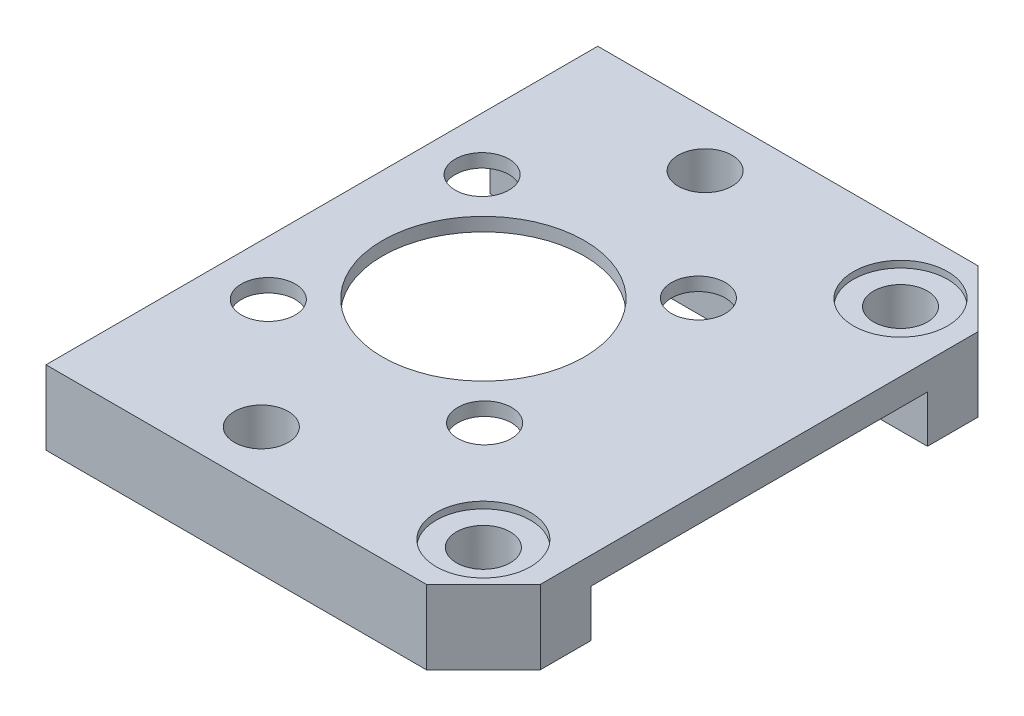
ISO-10303-21;
HEADER;
FILE_DESCRIPTION(('STEP AP214'),'2;1');
FILE_NAME('part.step','',(''),(''),'','','');
FILE_SCHEMA(('AUTOMOTIVE_DESIGN { 1 0 10303 214 1 1 1 1 }'));
ENDSEC;
DATA;
#1=APPLICATION_CONTEXT('core data for automotive mechanical design processes');
#2=APPLICATION_PROTOCOL_DEFINITION('international standard','automotive_design',2000,#1);
#3=PRODUCT_CONTEXT('',#1,'mechanical');
#4=PRODUCT('Part','Part','',(#3));
#5=PRODUCT_RELATED_PRODUCT_CATEGORY('part','',(#4));
#6=PRODUCT_DEFINITION_FORMATION('','',#4);
#7=PRODUCT_DEFINITION_CONTEXT('part definition',#1,'design');
#8=PRODUCT_DEFINITION('design','',#6,#7);
#9=PRODUCT_DEFINITION_SHAPE('','',#8);
#10=(LENGTH_UNIT() NAMED_UNIT(*) SI_UNIT(.MILLI.,.METRE.));
#11=(NAMED_UNIT(*) PLANE_ANGLE_UNIT() SI_UNIT($,.RADIAN.));
#12=(NAMED_UNIT(*) SI_UNIT($,.STERADIAN.) SOLID_ANGLE_UNIT());
#13=UNCERTAINTY_MEASURE_WITH_UNIT(LENGTH_MEASURE(1.E-05),#10,'distance_accuracy_value','');
#14=(GEOMETRIC_REPRESENTATION_CONTEXT(3) GLOBAL_UNCERTAINTY_ASSIGNED_CONTEXT((#13)) GLOBAL_UNIT_ASSIGNED_CONTEXT((#10,
#11,#12)) REPRESENTATION_CONTEXT('',''));
#15=CARTESIAN_POINT('',(0.,0.,0.));
#16=DIRECTION('',(0.,0.,1.));
#17=DIRECTION('',(1.,0.,0.));
#18=AXIS2_PLACEMENT_3D('',#15,#16,#17);
#19=CARTESIAN_POINT('',(12.5,1.,-12.5));
#20=DIRECTION('',(1.,0.,0.));
#21=DIRECTION('',(0.,0.,-1.));
#22=AXIS2_PLACEMENT_3D('',#19,#20,#21);
#23=PLANE('',#22);
#24=DIRECTION('',(0.,0.,1.));
#25=VECTOR('',#24,1.);
#26=CARTESIAN_POINT('',(12.5,0.,-12.5));
#27=LINE('',#26,#25);
#28=CARTESIAN_POINT('',(12.5,0.,-12.5));
#29=VERTEX_POINT('',#28);
#30=CARTESIAN_POINT('',(12.5,0.,12.5));
#31=VERTEX_POINT('',#30);
#32=EDGE_CURVE('E177',#29,#31,#27,.T.);
#33=ORIENTED_EDGE('',*,*,#32,.T.);
#34=DIRECTION('',(0.,-1.,0.));
#35=VECTOR('',#34,1.);
#36=CARTESIAN_POINT('',(12.5,1.,12.5));
#37=LINE('',#36,#35);
#38=CARTESIAN_POINT('',(12.5,1.,12.5));
#39=VERTEX_POINT('',#38);
#40=EDGE_CURVE('E189',#39,#31,#37,.T.);
#41=ORIENTED_EDGE('',*,*,#40,.F.);
#42=DIRECTION('',(0.,0.,1.));
#43=VECTOR('',#42,1.);
#44=CARTESIAN_POINT('',(12.5,1.,-12.5));
#45=LINE('',#44,#43);
#46=CARTESIAN_POINT('',(12.5,1.,-12.5));
#47=VERTEX_POINT('',#46);
#48=EDGE_CURVE('E183',#47,#39,#45,.T.);
#49=ORIENTED_EDGE('',*,*,#48,.F.);
#50=DIRECTION('',(0.,-1.,0.));
#51=VECTOR('',#50,1.);
#52=CARTESIAN_POINT('',(12.5,1.,-12.5));
#53=LINE('',#52,#51);
#54=EDGE_CURVE('E191',#47,#29,#53,.T.);
#55=ORIENTED_EDGE('',*,*,#54,.T.);
#56=EDGE_LOOP('',(#33,#41,#49,#55));
#57=FACE_BOUND('',#56,.T.);
#58=ADVANCED_FACE('F41',(#57),#23,.F.);
#59=CARTESIAN_POINT('',(0.,2.,0.));
#60=DIRECTION('',(0.,-1.,0.));
#61=DIRECTION('',(0.,0.,-1.));
#62=AXIS2_PLACEMENT_3D('',#59,#60,#61);
#63=PLANE('',#62);
#64=DIRECTION('',(-1.,0.,0.));
#65=VECTOR('',#64,1.);
#66=CARTESIAN_POINT('',(-20.5,2.,-20.5));
#67=LINE('',#66,#65);
#68=CARTESIAN_POINT('',(16.2573593128807,2.,-20.5));
#69=VERTEX_POINT('',#68);
#70=CARTESIAN_POINT('',(-12.,2.,-20.5));
#71=VERTEX_POINT('',#70);
#72=EDGE_CURVE('E228',#69,#71,#67,.T.);
#73=ORIENTED_EDGE('',*,*,#72,.T.);
#74=DIRECTION('',(0.,0.,-1.));
#75=VECTOR('',#74,1.);
#76=CARTESIAN_POINT('',(-12.,2.,-20.5));
#77=LINE('',#76,#75);
#78=CARTESIAN_POINT('',(-12.0000000000002,2.,20.5));
#79=VERTEX_POINT('',#78);
#80=EDGE_CURVE('E414',#79,#71,#77,.T.);
#81=ORIENTED_EDGE('',*,*,#80,.F.);
#82=DIRECTION('',(1.,0.,0.));
#83=VECTOR('',#82,1.);
#84=CARTESIAN_POINT('',(-20.5,2.,20.5));
#85=LINE('',#84,#83);
#86=CARTESIAN_POINT('',(16.2573593128807,2.,20.5));
#87=VERTEX_POINT('',#86);
#88=EDGE_CURVE('E146',#79,#87,#85,.T.);
#89=ORIENTED_EDGE('',*,*,#88,.T.);
#90=DIRECTION('',(-0.707106781186546,0.,0.707106781186549));
#91=VECTOR('',#90,1.);
#92=CARTESIAN_POINT('',(20.5,2.,16.2573593128807));
#93=LINE('',#92,#91);
#94=CARTESIAN_POINT('',(20.5,2.,16.2573593128807));
#95=VERTEX_POINT('',#94);
#96=EDGE_CURVE('E175',#95,#87,#93,.T.);
#97=ORIENTED_EDGE('',*,*,#96,.F.);
#98=DIRECTION('',(0.,0.,-1.));
#99=VECTOR('',#98,1.);
#100=CARTESIAN_POINT('',(20.5,2.,20.5));
#101=LINE('',#100,#99);
#102=CARTESIAN_POINT('',(20.5,2.,-16.2573593128807));
#103=VERTEX_POINT('',#102);
#104=EDGE_CURVE('E225',#95,#103,#101,.T.);
#105=ORIENTED_EDGE('',*,*,#104,.T.);
#106=DIRECTION('',(0.707106781186549,0.,0.707106781186546));
#107=VECTOR('',#106,1.);
#108=CARTESIAN_POINT('',(16.2573593128807,2.,-20.5));
#109=LINE('',#108,#107);
#110=EDGE_CURVE('E171',#69,#103,#109,.T.);
#111=ORIENTED_EDGE('',*,*,#110,.F.);
#112=EDGE_LOOP('',(#73,#81,#89,#97,#105,#111));
#113=FACE_BOUND('',#112,.T.);
#114=CARTESIAN_POINT('',(15.5000000000001,2.,-15.4999999999999));
#115=DIRECTION('',(0.,1.,0.));
#116=DIRECTION('',(0.,0.,1.));
#117=AXIS2_PLACEMENT_3D('',#114,#115,#116);
#118=CIRCLE('',#117,3.5);
#119=CARTESIAN_POINT('',(15.5000000000001,2.,-11.9999999999999));
#120=VERTEX_POINT('',#119);
#121=EDGE_CURVE('E352',#120,#120,#118,.T.);
#122=ORIENTED_EDGE('',*,*,#121,.F.);
#123=EDGE_LOOP('',(#122));
#124=FACE_BOUND('',#123,.T.);
#125=CARTESIAN_POINT('',(15.4999999999999,2.,15.5000000000001));
#126=DIRECTION('',(0.,1.,0.));
#127=DIRECTION('',(0.,0.,1.));
#128=AXIS2_PLACEMENT_3D('',#125,#126,#127);
#129=CIRCLE('',#128,3.5);
#130=CARTESIAN_POINT('',(15.4999999999999,2.,19.0000000000001));
#131=VERTEX_POINT('',#130);
#132=EDGE_CURVE('E348',#131,#131,#129,.T.);
#133=ORIENTED_EDGE('',*,*,#132,.F.);
#134=EDGE_LOOP('',(#133));
#135=FACE_BOUND('',#134,.T.);
#136=CARTESIAN_POINT('',(0.,2.,16.5));
#137=DIRECTION('',(0.,-1.,0.));
#138=DIRECTION('',(0.,0.,-1.));
#139=AXIS2_PLACEMENT_3D('',#136,#137,#138);
#140=CIRCLE('',#139,2.);
#141=CARTESIAN_POINT('',(0.,2.,14.5));
#142=VERTEX_POINT('',#141);
#143=EDGE_CURVE('E155',#142,#142,#140,.T.);
#144=ORIENTED_EDGE('',*,*,#143,.T.);
#145=EDGE_LOOP('',(#144));
#146=FACE_BOUND('',#145,.T.);
#147=CARTESIAN_POINT('',(-7.94318190681312,2.,8.03715504362562));
#148=DIRECTION('',(0.,-1.,0.));
#149=DIRECTION('',(0.,0.,-1.));
#150=AXIS2_PLACEMENT_3D('',#147,#148,#149);
#151=CIRCLE('',#150,2.);
#152=CARTESIAN_POINT('',(-7.94318190681312,2.,6.03715504362562));
#153=VERTEX_POINT('',#152);
#154=EDGE_CURVE('E216',#153,#153,#151,.T.);
#155=ORIENTED_EDGE('',*,*,#154,.T.);
#156=EDGE_LOOP('',(#155));
#157=FACE_BOUND('',#156,.T.);
#158=CARTESIAN_POINT('',(8.03715504362564,2.,7.94318190681309));
#159=DIRECTION('',(0.,-1.,0.));
#160=DIRECTION('',(0.,0.,-1.));
#161=AXIS2_PLACEMENT_3D('',#158,#159,#160);
#162=CIRCLE('',#161,2.);
#163=CARTESIAN_POINT('',(8.03715504362564,2.,5.94318190681309));
#164=VERTEX_POINT('',#163);
#165=EDGE_CURVE('E213',#164,#164,#162,.T.);
#166=ORIENTED_EDGE('',*,*,#165,.T.);
#167=EDGE_LOOP('',(#166));
#168=FACE_BOUND('',#167,.T.);
#169=CARTESIAN_POINT('',(7.94318190681312,2.,-8.03715504362567));
#170=DIRECTION('',(0.,-1.,0.));
#171=DIRECTION('',(0.,0.,-1.));
#172=AXIS2_PLACEMENT_3D('',#169,#170,#171);
#173=CIRCLE('',#172,2.);
#174=CARTESIAN_POINT('',(7.94318190681312,2.,-10.0371550436257));
#175=VERTEX_POINT('',#174);
#176=EDGE_CURVE('E217',#175,#175,#173,.T.);
#177=ORIENTED_EDGE('',*,*,#176,.T.);
#178=EDGE_LOOP('',(#177));
#179=FACE_BOUND('',#178,.T.);
#180=CARTESIAN_POINT('',(-8.03715504362565,2.,-7.94318190681315));
#181=DIRECTION('',(0.,-1.,0.));
#182=DIRECTION('',(0.,0.,-1.));
#183=AXIS2_PLACEMENT_3D('',#180,#181,#182);
#184=CIRCLE('',#183,2.);
#185=CARTESIAN_POINT('',(-8.03715504362565,2.,-9.94318190681315));
#186=VERTEX_POINT('',#185);
#187=EDGE_CURVE('E212',#186,#186,#184,.T.);
#188=ORIENTED_EDGE('',*,*,#187,.T.);
#189=EDGE_LOOP('',(#188));
#190=FACE_BOUND('',#189,.T.);
#191=CARTESIAN_POINT('',(0.,2.,0.));
#192=DIRECTION('',(0.,1.,0.));
#193=DIRECTION('',(0.,0.,1.));
#194=AXIS2_PLACEMENT_3D('',#191,#192,#193);
#195=CIRCLE('',#194,7.5);
#196=CARTESIAN_POINT('',(0.,2.,7.5));
#197=VERTEX_POINT('',#196);
#198=EDGE_CURVE('E209',#197,#197,#195,.T.);
#199=ORIENTED_EDGE('',*,*,#198,.F.);
#200=EDGE_LOOP('',(#199));
#201=FACE_BOUND('',#200,.T.);
#202=CARTESIAN_POINT('',(0.,2.,-16.4789088056835));
#203=DIRECTION('',(0.,-1.,0.));
#204=DIRECTION('',(0.,0.,-1.));
#205=AXIS2_PLACEMENT_3D('',#202,#203,#204);
#206=CIRCLE('',#205,2.);
#207=CARTESIAN_POINT('',(0.,2.,-18.4789088056835));
#208=VERTEX_POINT('',#207);
#209=EDGE_CURVE('E400',#208,#208,#206,.F.);
#210=ORIENTED_EDGE('',*,*,#209,.F.);
#211=EDGE_LOOP('',(#210));
#212=FACE_BOUND('',#211,.T.);
#213=ADVANCED_FACE('F252',(#113,#124,#135,#146,#157,#168,#179,#190,#201,#212),#63,.F.);
#214=CARTESIAN_POINT('',(15.4999999999999,-13.3994949366117,15.5000000000001));
#215=DIRECTION('',(0.,1.,0.));
#216=DIRECTION('',(0.,0.,1.));
#217=AXIS2_PLACEMENT_3D('',#214,#215,#216);
#218=CYLINDRICAL_SURFACE('',#217,3.5);
#219=ORIENTED_EDGE('',*,*,#132,.T.);
#220=EDGE_LOOP('',(#219));
#221=FACE_BOUND('',#220,.T.);
#222=CARTESIAN_POINT('',(15.4999999999999,1.5,15.5000000000001));
#223=DIRECTION('',(0.,-1.,0.));
#224=DIRECTION('',(0.,0.,-1.));
#225=AXIS2_PLACEMENT_3D('',#222,#223,#224);
#226=CIRCLE('',#225,3.5);
#227=CARTESIAN_POINT('',(15.4999999999999,1.5,12.0000000000001));
#228=VERTEX_POINT('',#227);
#229=EDGE_CURVE('E12',#228,#228,#226,.F.);
#230=ORIENTED_EDGE('',*,*,#229,.F.);
#231=EDGE_LOOP('',(#230));
#232=FACE_BOUND('',#231,.T.);
#233=ADVANCED_FACE('F242',(#221,#232),#218,.F.);
#234=CARTESIAN_POINT('',(15.5000000000001,-13.3994949366117,-15.4999999999999));
#235=DIRECTION('',(0.,1.,0.));
#236=DIRECTION('',(0.,0.,1.));
#237=AXIS2_PLACEMENT_3D('',#234,#235,#236);
#238=CYLINDRICAL_SURFACE('',#237,3.5);
#239=ORIENTED_EDGE('',*,*,#121,.T.);
#240=EDGE_LOOP('',(#239));
#241=FACE_BOUND('',#240,.T.);
#242=CARTESIAN_POINT('',(15.5000000000001,1.5,-15.4999999999999));
#243=DIRECTION('',(0.,-1.,0.));
#244=DIRECTION('',(0.,0.,-1.));
#245=AXIS2_PLACEMENT_3D('',#242,#243,#244);
#246=CIRCLE('',#245,3.5);
#247=CARTESIAN_POINT('',(15.5000000000001,1.5,-18.9999999999999));
#248=VERTEX_POINT('',#247);
#249=EDGE_CURVE('E49',#248,#248,#246,.F.);
#250=ORIENTED_EDGE('',*,*,#249,.F.);
#251=EDGE_LOOP('',(#250));
#252=FACE_BOUND('',#251,.T.);
#253=ADVANCED_FACE('F239',(#241,#252),#238,.F.);
#254=CARTESIAN_POINT('',(0.,0.,0.));
#255=DIRECTION('',(0.,-1.,0.));
#256=DIRECTION('',(0.,0.,-1.));
#257=AXIS2_PLACEMENT_3D('',#254,#255,#256);
#258=PLANE('',#257);
#259=DIRECTION('',(0.,0.,-1.));
#260=VECTOR('',#259,1.);
#261=CARTESIAN_POINT('',(20.5,0.,20.5));
#262=LINE('',#261,#260);
#263=CARTESIAN_POINT('',(20.5,0.,12.5));
#264=VERTEX_POINT('',#263);
#265=CARTESIAN_POINT('',(20.5,0.,-12.5));
#266=VERTEX_POINT('',#265);
#267=EDGE_CURVE('E224',#264,#266,#262,.T.);
#268=ORIENTED_EDGE('',*,*,#267,.F.);
#269=DIRECTION('',(1.,0.,0.));
#270=VECTOR('',#269,1.);
#271=CARTESIAN_POINT('',(12.5,0.,12.5));
#272=LINE('',#271,#270);
#273=EDGE_CURVE('E408',#31,#264,#272,.T.);
#274=ORIENTED_EDGE('',*,*,#273,.F.);
#275=ORIENTED_EDGE('',*,*,#32,.F.);
#276=DIRECTION('',(-1.,0.,0.));
#277=VECTOR('',#276,1.);
#278=CARTESIAN_POINT('',(12.5,0.,-12.5));
#279=LINE('',#278,#277);
#280=EDGE_CURVE('E395',#266,#29,#279,.T.);
#281=ORIENTED_EDGE('',*,*,#280,.F.);
#282=EDGE_LOOP('',(#268,#274,#275,#281));
#283=FACE_BOUND('',#282,.T.);
#284=ADVANCED_FACE('F241',(#283),#258,.T.);
#285=CARTESIAN_POINT('',(-12.5,1.,12.5));
#286=DIRECTION('',(0.,0.,1.));
#287=DIRECTION('',(1.,0.,0.));
#288=AXIS2_PLACEMENT_3D('',#285,#286,#287);
#289=PLANE('',#288);
#290=DIRECTION('',(1.,0.,0.));
#291=VECTOR('',#290,1.);
#292=CARTESIAN_POINT('',(-12.5,-3.5,12.5));
#293=LINE('',#292,#291);
#294=CARTESIAN_POINT('',(-12.0000000000002,-3.5,12.5));
#295=VERTEX_POINT('',#294);
#296=CARTESIAN_POINT('',(20.5,-3.5,12.5));
#297=VERTEX_POINT('',#296);
#298=EDGE_CURVE('E154',#295,#297,#293,.T.);
#299=ORIENTED_EDGE('',*,*,#298,.F.);
#300=DIRECTION('',(0.,1.,0.));
#301=VECTOR('',#300,1.);
#302=CARTESIAN_POINT('',(-12.0000000000001,1.,12.5));
#303=LINE('',#302,#301);
#304=CARTESIAN_POINT('',(-12.0000000000001,1.,12.5));
#305=VERTEX_POINT('',#304);
#306=EDGE_CURVE('E56',#295,#305,#303,.T.);
#307=ORIENTED_EDGE('',*,*,#306,.T.);
#308=DIRECTION('',(-1.,0.,0.));
#309=VECTOR('',#308,1.);
#310=CARTESIAN_POINT('',(-12.5,1.,12.5));
#311=LINE('',#310,#309);
#312=EDGE_CURVE('E185',#39,#305,#311,.T.);
#313=ORIENTED_EDGE('',*,*,#312,.F.);
#314=ORIENTED_EDGE('',*,*,#40,.T.);
#315=ORIENTED_EDGE('',*,*,#273,.T.);
#316=DIRECTION('',(0.,-1.,0.));
#317=VECTOR('',#316,1.);
#318=CARTESIAN_POINT('',(20.5,26.2488094968134,12.5));
#319=LINE('',#318,#317);
#320=EDGE_CURVE('E410',#264,#297,#319,.T.);
#321=ORIENTED_EDGE('',*,*,#320,.T.);
#322=EDGE_LOOP('',(#299,#307,#313,#314,#315,#321));
#323=FACE_BOUND('',#322,.T.);
#324=ADVANCED_FACE('F249',(#323),#289,.F.);
#325=CARTESIAN_POINT('',(-12.5,1.,-12.5));
#326=DIRECTION('',(0.,0.,-1.));
#327=DIRECTION('',(-1.,0.,0.));
#328=AXIS2_PLACEMENT_3D('',#325,#326,#327);
#329=PLANE('',#328);
#330=DIRECTION('',(1.,0.,0.));
#331=VECTOR('',#330,1.);
#332=CARTESIAN_POINT('',(-12.5,1.,-12.5));
#333=LINE('',#332,#331);
#334=CARTESIAN_POINT('',(-12.,1.,-12.5));
#335=VERTEX_POINT('',#334);
#336=EDGE_CURVE('E64',#335,#47,#333,.T.);
#337=ORIENTED_EDGE('',*,*,#336,.F.);
#338=DIRECTION('',(0.,-1.,0.));
#339=VECTOR('',#338,1.);
#340=CARTESIAN_POINT('',(-12.,1.,-12.5));
#341=LINE('',#340,#339);
#342=CARTESIAN_POINT('',(-12.,-3.5,-12.5));
#343=VERTEX_POINT('',#342);
#344=EDGE_CURVE('E391',#335,#343,#341,.T.);
#345=ORIENTED_EDGE('',*,*,#344,.T.);
#346=DIRECTION('',(-1.,0.,0.));
#347=VECTOR('',#346,1.);
#348=CARTESIAN_POINT('',(12.5,-3.5,-12.5));
#349=LINE('',#348,#347);
#350=CARTESIAN_POINT('',(20.5,-3.5,-12.5));
#351=VERTEX_POINT('',#350);
#352=EDGE_CURVE('E157',#351,#343,#349,.T.);
#353=ORIENTED_EDGE('',*,*,#352,.F.);
#354=DIRECTION('',(0.,-1.,0.));
#355=VECTOR('',#354,1.);
#356=CARTESIAN_POINT('',(20.5,26.2488094968134,-12.5));
#357=LINE('',#356,#355);
#358=EDGE_CURVE('E355',#266,#351,#357,.T.);
#359=ORIENTED_EDGE('',*,*,#358,.F.);
#360=ORIENTED_EDGE('',*,*,#280,.T.);
#361=ORIENTED_EDGE('',*,*,#54,.F.);
#362=EDGE_LOOP('',(#337,#345,#353,#359,#360,#361));
#363=FACE_BOUND('',#362,.T.);
#364=ADVANCED_FACE('F381',(#363),#329,.F.);
#365=CARTESIAN_POINT('',(15.5,2.,15.5));
#366=DIRECTION('',(0.,-1.,0.));
#367=DIRECTION('',(0.,0.,-1.));
#368=AXIS2_PLACEMENT_3D('',#365,#366,#367);
#369=CYLINDRICAL_SURFACE('',#368,2.);
#370=CARTESIAN_POINT('',(15.5,-3.5,15.5));
#371=DIRECTION('',(0.,1.,0.));
#372=DIRECTION('',(0.,0.,1.));
#373=AXIS2_PLACEMENT_3D('',#370,#371,#372);
#374=CIRCLE('',#373,2.);
#375=CARTESIAN_POINT('',(15.5,-3.5,17.5));
#376=VERTEX_POINT('',#375);
#377=EDGE_CURVE('E322',#376,#376,#374,.F.);
#378=ORIENTED_EDGE('',*,*,#377,.T.);
#379=EDGE_LOOP('',(#378));
#380=FACE_BOUND('',#379,.T.);
#381=CARTESIAN_POINT('',(15.4999999999997,1.5,15.5000000000003));
#382=DIRECTION('',(0.,-1.,0.));
#383=DIRECTION('',(0.,0.,-1.));
#384=AXIS2_PLACEMENT_3D('',#381,#382,#383);
#385=CIRCLE('',#384,2.00000000000012);
#386=CARTESIAN_POINT('',(15.4999999999997,1.5,13.5000000000002));
#387=VERTEX_POINT('',#386);
#388=EDGE_CURVE('E349',#387,#387,#385,.T.);
#389=ORIENTED_EDGE('',*,*,#388,.F.);
#390=EDGE_LOOP('',(#389));
#391=FACE_BOUND('',#390,.T.);
#392=ADVANCED_FACE('F342',(#380,#391),#369,.F.);
#393=CARTESIAN_POINT('',(15.5,2.,-15.5));
#394=DIRECTION('',(0.,-1.,0.));
#395=DIRECTION('',(0.,0.,-1.));
#396=AXIS2_PLACEMENT_3D('',#393,#394,#395);
#397=CYLINDRICAL_SURFACE('',#396,2.);
#398=CARTESIAN_POINT('',(15.5,-3.5,-15.5));
#399=DIRECTION('',(0.,1.,0.));
#400=DIRECTION('',(0.,0.,1.));
#401=AXIS2_PLACEMENT_3D('',#398,#399,#400);
#402=CIRCLE('',#401,2.);
#403=CARTESIAN_POINT('',(15.5,-3.5,-13.5));
#404=VERTEX_POINT('',#403);
#405=EDGE_CURVE('E309',#404,#404,#402,.F.);
#406=ORIENTED_EDGE('',*,*,#405,.T.);
#407=EDGE_LOOP('',(#406));
#408=FACE_BOUND('',#407,.T.);
#409=CARTESIAN_POINT('',(15.5000000000003,1.5,-15.4999999999997));
#410=DIRECTION('',(0.,-1.,0.));
#411=DIRECTION('',(0.,0.,-1.));
#412=AXIS2_PLACEMENT_3D('',#409,#410,#411);
#413=CIRCLE('',#412,2.00000000000012);
#414=CARTESIAN_POINT('',(15.5000000000003,1.5,-17.4999999999998));
#415=VERTEX_POINT('',#414);
#416=EDGE_CURVE('E346',#415,#415,#413,.T.);
#417=ORIENTED_EDGE('',*,*,#416,.F.);
#418=EDGE_LOOP('',(#417));
#419=FACE_BOUND('',#418,.T.);
#420=ADVANCED_FACE('F298',(#408,#419),#397,.F.);
#421=CARTESIAN_POINT('',(20.5,2.,20.5));
#422=DIRECTION('',(-1.,0.,0.));
#423=DIRECTION('',(0.,0.,1.));
#424=AXIS2_PLACEMENT_3D('',#421,#422,#423);
#425=PLANE('',#424);
#426=ORIENTED_EDGE('',*,*,#267,.T.);
#427=ORIENTED_EDGE('',*,*,#358,.T.);
#428=DIRECTION('',(0.,0.,-1.));
#429=VECTOR('',#428,1.);
#430=CARTESIAN_POINT('',(20.5,-3.5,0.));
#431=LINE('',#430,#429);
#432=CARTESIAN_POINT('',(20.5,-3.5,-16.2573593128807));
#433=VERTEX_POINT('',#432);
#434=EDGE_CURVE('E314',#351,#433,#431,.T.);
#435=ORIENTED_EDGE('',*,*,#434,.T.);
#436=DIRECTION('',(0.,1.,0.));
#437=VECTOR('',#436,1.);
#438=CARTESIAN_POINT('',(20.5,0.,-16.2573593128807));
#439=LINE('',#438,#437);
#440=EDGE_CURVE('E172',#433,#103,#439,.T.);
#441=ORIENTED_EDGE('',*,*,#440,.T.);
#442=ORIENTED_EDGE('',*,*,#104,.F.);
#443=DIRECTION('',(0.,1.,0.));
#444=VECTOR('',#443,1.);
#445=CARTESIAN_POINT('',(20.5,0.,16.2573593128807));
#446=LINE('',#445,#444);
#447=CARTESIAN_POINT('',(20.5,-3.5,16.2573593128807));
#448=VERTEX_POINT('',#447);
#449=EDGE_CURVE('E178',#448,#95,#446,.T.);
#450=ORIENTED_EDGE('',*,*,#449,.F.);
#451=DIRECTION('',(0.,0.,-1.));
#452=VECTOR('',#451,1.);
#453=CARTESIAN_POINT('',(20.5,-3.5,0.));
#454=LINE('',#453,#452);
#455=EDGE_CURVE('E319',#448,#297,#454,.T.);
#456=ORIENTED_EDGE('',*,*,#455,.T.);
#457=ORIENTED_EDGE('',*,*,#320,.F.);
#458=EDGE_LOOP('',(#426,#427,#435,#441,#442,#450,#456,#457));
#459=FACE_BOUND('',#458,.T.);
#460=ADVANCED_FACE('F43',(#459),#425,.F.);
#461=CARTESIAN_POINT('',(-20.5,2.,-20.5));
#462=DIRECTION('',(0.,0.,1.));
#463=DIRECTION('',(1.,0.,0.));
#464=AXIS2_PLACEMENT_3D('',#461,#462,#463);
#465=PLANE('',#464);
#466=DIRECTION('',(-1.,0.,0.));
#467=VECTOR('',#466,1.);
#468=CARTESIAN_POINT('',(0.,-3.5,-20.5));
#469=LINE('',#468,#467);
#470=CARTESIAN_POINT('',(16.2573593128807,-3.5,-20.5));
#471=VERTEX_POINT('',#470);
#472=CARTESIAN_POINT('',(-12.,-3.5,-20.5));
#473=VERTEX_POINT('',#472);
#474=EDGE_CURVE('E303',#471,#473,#469,.T.);
#475=ORIENTED_EDGE('',*,*,#474,.T.);
#476=DIRECTION('',(0.,1.,0.));
#477=VECTOR('',#476,1.);
#478=CARTESIAN_POINT('',(-12.,-3.5,-20.5));
#479=LINE('',#478,#477);
#480=EDGE_CURVE('E147',#473,#71,#479,.T.);
#481=ORIENTED_EDGE('',*,*,#480,.T.);
#482=ORIENTED_EDGE('',*,*,#72,.F.);
#483=DIRECTION('',(0.,1.,0.));
#484=VECTOR('',#483,1.);
#485=CARTESIAN_POINT('',(16.2573593128807,0.,-20.5));
#486=LINE('',#485,#484);
#487=EDGE_CURVE('E169',#471,#69,#486,.T.);
#488=ORIENTED_EDGE('',*,*,#487,.F.);
#489=EDGE_LOOP('',(#475,#481,#482,#488));
#490=FACE_BOUND('',#489,.T.);
#491=ADVANCED_FACE('F291',(#490),#465,.F.);
#492=CARTESIAN_POINT('',(-20.5,2.,20.5));
#493=DIRECTION('',(0.,0.,-1.));
#494=DIRECTION('',(-1.,0.,0.));
#495=AXIS2_PLACEMENT_3D('',#492,#493,#494);
#496=PLANE('',#495);
#497=ORIENTED_EDGE('',*,*,#88,.F.);
#498=DIRECTION('',(0.,1.,0.));
#499=VECTOR('',#498,1.);
#500=CARTESIAN_POINT('',(-12.0000000000002,-3.5,20.5));
#501=LINE('',#500,#499);
#502=CARTESIAN_POINT('',(-12.0000000000002,-3.5,20.5));
#503=VERTEX_POINT('',#502);
#504=EDGE_CURVE('E133',#503,#79,#501,.T.);
#505=ORIENTED_EDGE('',*,*,#504,.F.);
#506=DIRECTION('',(-1.,0.,0.));
#507=VECTOR('',#506,1.);
#508=CARTESIAN_POINT('',(-12.5,-3.5,20.5));
#509=LINE('',#508,#507);
#510=CARTESIAN_POINT('',(16.2573593128807,-3.5,20.5));
#511=VERTEX_POINT('',#510);
#512=EDGE_CURVE('E144',#511,#503,#509,.T.);
#513=ORIENTED_EDGE('',*,*,#512,.F.);
#514=DIRECTION('',(0.,1.,0.));
#515=VECTOR('',#514,1.);
#516=CARTESIAN_POINT('',(16.2573593128807,0.,20.5));
#517=LINE('',#516,#515);
#518=EDGE_CURVE('E168',#511,#87,#517,.T.);
#519=ORIENTED_EDGE('',*,*,#518,.T.);
#520=EDGE_LOOP('',(#497,#505,#513,#519));
#521=FACE_BOUND('',#520,.T.);
#522=ADVANCED_FACE('F142',(#521),#496,.F.);
#523=CARTESIAN_POINT('',(-7.94318190681312,2.,8.03715504362562));
#524=DIRECTION('',(0.,-1.,0.));
#525=DIRECTION('',(0.,0.,-1.));
#526=AXIS2_PLACEMENT_3D('',#523,#524,#525);
#527=CYLINDRICAL_SURFACE('',#526,2.);
#528=CARTESIAN_POINT('',(-7.94318190681312,1.,8.03715504362562));
#529=DIRECTION('',(0.,1.,0.));
#530=DIRECTION('',(0.,0.,1.));
#531=AXIS2_PLACEMENT_3D('',#528,#529,#530);
#532=CIRCLE('',#531,2.);
#533=CARTESIAN_POINT('',(-7.94318190681312,1.,10.0371550436256));
#534=VERTEX_POINT('',#533);
#535=EDGE_CURVE('E206',#534,#534,#532,.F.);
#536=ORIENTED_EDGE('',*,*,#535,.T.);
#537=EDGE_LOOP('',(#536));
#538=FACE_BOUND('',#537,.T.);
#539=ORIENTED_EDGE('',*,*,#154,.F.);
#540=EDGE_LOOP('',(#539));
#541=FACE_BOUND('',#540,.T.);
#542=ADVANCED_FACE('F279',(#538,#541),#527,.F.);
#543=CARTESIAN_POINT('',(8.03715504362564,2.,7.94318190681309));
#544=DIRECTION('',(0.,-1.,0.));
#545=DIRECTION('',(0.,0.,-1.));
#546=AXIS2_PLACEMENT_3D('',#543,#544,#545);
#547=CYLINDRICAL_SURFACE('',#546,2.);
#548=CARTESIAN_POINT('',(8.03715504362564,1.,7.94318190681309));
#549=DIRECTION('',(0.,1.,0.));
#550=DIRECTION('',(0.,0.,1.));
#551=AXIS2_PLACEMENT_3D('',#548,#549,#550);
#552=CIRCLE('',#551,2.);
#553=CARTESIAN_POINT('',(8.03715504362564,1.,9.94318190681309));
#554=VERTEX_POINT('',#553);
#555=EDGE_CURVE('E203',#554,#554,#552,.F.);
#556=ORIENTED_EDGE('',*,*,#555,.T.);
#557=EDGE_LOOP('',(#556));
#558=FACE_BOUND('',#557,.T.);
#559=ORIENTED_EDGE('',*,*,#165,.F.);
#560=EDGE_LOOP('',(#559));
#561=FACE_BOUND('',#560,.T.);
#562=ADVANCED_FACE('F275',(#558,#561),#547,.F.);
#563=CARTESIAN_POINT('',(7.94318190681312,2.,-8.03715504362567));
#564=DIRECTION('',(0.,-1.,0.));
#565=DIRECTION('',(0.,0.,-1.));
#566=AXIS2_PLACEMENT_3D('',#563,#564,#565);
#567=CYLINDRICAL_SURFACE('',#566,2.);
#568=CARTESIAN_POINT('',(7.94318190681312,1.,-8.03715504362567));
#569=DIRECTION('',(0.,1.,0.));
#570=DIRECTION('',(0.,0.,1.));
#571=AXIS2_PLACEMENT_3D('',#568,#569,#570);
#572=CIRCLE('',#571,2.);
#573=CARTESIAN_POINT('',(7.94318190681312,1.,-6.03715504362567));
#574=VERTEX_POINT('',#573);
#575=EDGE_CURVE('E200',#574,#574,#572,.F.);
#576=ORIENTED_EDGE('',*,*,#575,.T.);
#577=EDGE_LOOP('',(#576));
#578=FACE_BOUND('',#577,.T.);
#579=ORIENTED_EDGE('',*,*,#176,.F.);
#580=EDGE_LOOP('',(#579));
#581=FACE_BOUND('',#580,.T.);
#582=ADVANCED_FACE('F278',(#578,#581),#567,.F.);
#583=CARTESIAN_POINT('',(-8.03715504362565,2.,-7.94318190681315));
#584=DIRECTION('',(0.,-1.,0.));
#585=DIRECTION('',(0.,0.,-1.));
#586=AXIS2_PLACEMENT_3D('',#583,#584,#585);
#587=CYLINDRICAL_SURFACE('',#586,2.);
#588=CARTESIAN_POINT('',(-8.03715504362565,1.,-7.94318190681315));
#589=DIRECTION('',(0.,1.,0.));
#590=DIRECTION('',(0.,0.,1.));
#591=AXIS2_PLACEMENT_3D('',#588,#589,#590);
#592=CIRCLE('',#591,2.);
#593=CARTESIAN_POINT('',(-8.03715504362565,1.,-5.94318190681315));
#594=VERTEX_POINT('',#593);
#595=EDGE_CURVE('E197',#594,#594,#592,.F.);
#596=ORIENTED_EDGE('',*,*,#595,.T.);
#597=EDGE_LOOP('',(#596));
#598=FACE_BOUND('',#597,.T.);
#599=ORIENTED_EDGE('',*,*,#187,.F.);
#600=EDGE_LOOP('',(#599));
#601=FACE_BOUND('',#600,.T.);
#602=ADVANCED_FACE('F273',(#598,#601),#587,.F.);
#603=CARTESIAN_POINT('',(0.,0.,0.));
#604=DIRECTION('',(0.,1.,0.));
#605=DIRECTION('',(0.,0.,1.));
#606=AXIS2_PLACEMENT_3D('',#603,#604,#605);
#607=CYLINDRICAL_SURFACE('',#606,7.5);
#608=CARTESIAN_POINT('',(0.,1.,0.));
#609=DIRECTION('',(0.,1.,0.));
#610=DIRECTION('',(0.,0.,1.));
#611=AXIS2_PLACEMENT_3D('',#608,#609,#610);
#612=CIRCLE('',#611,7.5);
#613=CARTESIAN_POINT('',(0.,1.,7.5));
#614=VERTEX_POINT('',#613);
#615=EDGE_CURVE('E194',#614,#614,#612,.F.);
#616=ORIENTED_EDGE('',*,*,#615,.T.);
#617=EDGE_LOOP('',(#616));
#618=FACE_BOUND('',#617,.T.);
#619=ORIENTED_EDGE('',*,*,#198,.T.);
#620=EDGE_LOOP('',(#619));
#621=FACE_BOUND('',#620,.T.);
#622=ADVANCED_FACE('F269',(#618,#621),#607,.F.);
#623=CARTESIAN_POINT('',(0.,1.,0.));
#624=DIRECTION('',(0.,1.,0.));
#625=DIRECTION('',(0.,0.,1.));
#626=AXIS2_PLACEMENT_3D('',#623,#624,#625);
#627=PLANE('',#626);
#628=ORIENTED_EDGE('',*,*,#555,.F.);
#629=EDGE_LOOP('',(#628));
#630=FACE_BOUND('',#629,.T.);
#631=ORIENTED_EDGE('',*,*,#595,.F.);
#632=EDGE_LOOP('',(#631));
#633=FACE_BOUND('',#632,.T.);
#634=ORIENTED_EDGE('',*,*,#312,.T.);
#635=DIRECTION('',(0.,0.,-1.));
#636=VECTOR('',#635,1.);
#637=CARTESIAN_POINT('',(-12.0000000000001,1.,0.));
#638=LINE('',#637,#636);
#639=EDGE_CURVE('E398',#305,#335,#638,.T.);
#640=ORIENTED_EDGE('',*,*,#639,.T.);
#641=ORIENTED_EDGE('',*,*,#336,.T.);
#642=ORIENTED_EDGE('',*,*,#48,.T.);
#643=EDGE_LOOP('',(#634,#640,#641,#642));
#644=FACE_BOUND('',#643,.T.);
#645=ORIENTED_EDGE('',*,*,#615,.F.);
#646=EDGE_LOOP('',(#645));
#647=FACE_BOUND('',#646,.T.);
#648=ORIENTED_EDGE('',*,*,#575,.F.);
#649=EDGE_LOOP('',(#648));
#650=FACE_BOUND('',#649,.T.);
#651=ORIENTED_EDGE('',*,*,#535,.F.);
#652=EDGE_LOOP('',(#651));
#653=FACE_BOUND('',#652,.T.);
#654=ADVANCED_FACE('F272',(#630,#633,#644,#647,#650,#653),#627,.F.);
#655=CARTESIAN_POINT('',(16.2573593128807,0.,-20.5));
#656=DIRECTION('',(-0.707106781186546,0.,0.707106781186549));
#657=DIRECTION('',(0.707106781186549,0.,0.707106781186546));
#658=AXIS2_PLACEMENT_3D('',#655,#656,#657);
#659=PLANE('',#658);
#660=ORIENTED_EDGE('',*,*,#110,.T.);
#661=ORIENTED_EDGE('',*,*,#440,.F.);
#662=DIRECTION('',(-0.707106781186549,0.,-0.707106781186546));
#663=VECTOR('',#662,1.);
#664=CARTESIAN_POINT('',(18.3786796564403,-3.5,-18.3786796564404));
#665=LINE('',#664,#663);
#666=EDGE_CURVE('E310',#433,#471,#665,.T.);
#667=ORIENTED_EDGE('',*,*,#666,.T.);
#668=ORIENTED_EDGE('',*,*,#487,.T.);
#669=EDGE_LOOP('',(#660,#661,#667,#668));
#670=FACE_BOUND('',#669,.T.);
#671=ADVANCED_FACE('F364',(#670),#659,.F.);
#672=CARTESIAN_POINT('',(20.5,0.,16.2573593128807));
#673=DIRECTION('',(-0.707106781186549,0.,-0.707106781186546));
#674=DIRECTION('',(-0.707106781186546,0.,0.707106781186549));
#675=AXIS2_PLACEMENT_3D('',#672,#673,#674);
#676=PLANE('',#675);
#677=ORIENTED_EDGE('',*,*,#96,.T.);
#678=ORIENTED_EDGE('',*,*,#518,.F.);
#679=DIRECTION('',(0.707106781186546,0.,-0.707106781186549));
#680=VECTOR('',#679,1.);
#681=CARTESIAN_POINT('',(18.3786796564404,-3.5,18.3786796564403));
#682=LINE('',#681,#680);
#683=EDGE_CURVE('E153',#511,#448,#682,.T.);
#684=ORIENTED_EDGE('',*,*,#683,.T.);
#685=ORIENTED_EDGE('',*,*,#449,.T.);
#686=EDGE_LOOP('',(#677,#678,#684,#685));
#687=FACE_BOUND('',#686,.T.);
#688=ADVANCED_FACE('F334',(#687),#676,.F.);
#689=CARTESIAN_POINT('',(0.,-3.5,0.));
#690=DIRECTION('',(0.,1.,0.));
#691=DIRECTION('',(0.,0.,1.));
#692=AXIS2_PLACEMENT_3D('',#689,#690,#691);
#693=PLANE('',#692);
#694=CARTESIAN_POINT('',(0.,-3.5,-16.4789088056835));
#695=DIRECTION('',(0.,-1.,0.));
#696=DIRECTION('',(0.,0.,-1.));
#697=AXIS2_PLACEMENT_3D('',#694,#695,#696);
#698=CIRCLE('',#697,2.);
#699=CARTESIAN_POINT('',(0.,-3.5,-18.4789088056835));
#700=VERTEX_POINT('',#699);
#701=EDGE_CURVE('E163',#700,#700,#698,.T.);
#702=ORIENTED_EDGE('',*,*,#701,.F.);
#703=EDGE_LOOP('',(#702));
#704=FACE_BOUND('',#703,.T.);
#705=ORIENTED_EDGE('',*,*,#352,.T.);
#706=DIRECTION('',(0.,0.,-1.));
#707=VECTOR('',#706,1.);
#708=CARTESIAN_POINT('',(-12.,-3.5,-20.5));
#709=LINE('',#708,#707);
#710=EDGE_CURVE('E138',#343,#473,#709,.T.);
#711=ORIENTED_EDGE('',*,*,#710,.T.);
#712=ORIENTED_EDGE('',*,*,#474,.F.);
#713=ORIENTED_EDGE('',*,*,#666,.F.);
#714=ORIENTED_EDGE('',*,*,#434,.F.);
#715=EDGE_LOOP('',(#705,#711,#712,#713,#714));
#716=FACE_BOUND('',#715,.T.);
#717=ORIENTED_EDGE('',*,*,#405,.F.);
#718=EDGE_LOOP('',(#717));
#719=FACE_BOUND('',#718,.T.);
#720=ADVANCED_FACE('F332',(#704,#716,#719),#693,.F.);
#721=CARTESIAN_POINT('',(0.,-3.5,0.));
#722=DIRECTION('',(0.,1.,0.));
#723=DIRECTION('',(0.,0.,1.));
#724=AXIS2_PLACEMENT_3D('',#721,#722,#723);
#725=PLANE('',#724);
#726=CARTESIAN_POINT('',(0.,-3.5,16.5));
#727=DIRECTION('',(0.,-1.,0.));
#728=DIRECTION('',(0.,0.,-1.));
#729=AXIS2_PLACEMENT_3D('',#726,#727,#728);
#730=CIRCLE('',#729,2.);
#731=CARTESIAN_POINT('',(0.,-3.5,14.5));
#732=VERTEX_POINT('',#731);
#733=EDGE_CURVE('E160',#732,#732,#730,.T.);
#734=ORIENTED_EDGE('',*,*,#733,.F.);
#735=EDGE_LOOP('',(#734));
#736=FACE_BOUND('',#735,.T.);
#737=ORIENTED_EDGE('',*,*,#512,.T.);
#738=EDGE_CURVE('E130',#503,#295,#709,.T.);
#739=ORIENTED_EDGE('',*,*,#738,.T.);
#740=ORIENTED_EDGE('',*,*,#298,.T.);
#741=ORIENTED_EDGE('',*,*,#455,.F.);
#742=ORIENTED_EDGE('',*,*,#683,.F.);
#743=EDGE_LOOP('',(#737,#739,#740,#741,#742));
#744=FACE_BOUND('',#743,.T.);
#745=ORIENTED_EDGE('',*,*,#377,.F.);
#746=EDGE_LOOP('',(#745));
#747=FACE_BOUND('',#746,.T.);
#748=ADVANCED_FACE('F149',(#736,#744,#747),#725,.F.);
#749=CARTESIAN_POINT('',(0.,2.,16.5));
#750=DIRECTION('',(0.,-1.,0.));
#751=DIRECTION('',(0.,0.,-1.));
#752=AXIS2_PLACEMENT_3D('',#749,#750,#751);
#753=CYLINDRICAL_SURFACE('',#752,2.);
#754=ORIENTED_EDGE('',*,*,#143,.F.);
#755=EDGE_LOOP('',(#754));
#756=FACE_BOUND('',#755,.T.);
#757=ORIENTED_EDGE('',*,*,#733,.T.);
#758=EDGE_LOOP('',(#757));
#759=FACE_BOUND('',#758,.T.);
#760=ADVANCED_FACE('F419',(#756,#759),#753,.F.);
#761=CARTESIAN_POINT('',(0.,2.,-16.4789088056835));
#762=DIRECTION('',(0.,-1.,0.));
#763=DIRECTION('',(0.,0.,-1.));
#764=AXIS2_PLACEMENT_3D('',#761,#762,#763);
#765=CYLINDRICAL_SURFACE('',#764,2.);
#766=ORIENTED_EDGE('',*,*,#209,.T.);
#767=EDGE_LOOP('',(#766));
#768=FACE_BOUND('',#767,.T.);
#769=ORIENTED_EDGE('',*,*,#701,.T.);
#770=EDGE_LOOP('',(#769));
#771=FACE_BOUND('',#770,.T.);
#772=ADVANCED_FACE('F330',(#768,#771),#765,.F.);
#773=CARTESIAN_POINT('',(0.,1.5,0.));
#774=DIRECTION('',(0.,-1.,0.));
#775=DIRECTION('',(0.,0.,-1.));
#776=AXIS2_PLACEMENT_3D('',#773,#774,#775);
#777=PLANE('',#776);
#778=ORIENTED_EDGE('',*,*,#416,.T.);
#779=EDGE_LOOP('',(#778));
#780=FACE_BOUND('',#779,.T.);
#781=ORIENTED_EDGE('',*,*,#249,.T.);
#782=EDGE_LOOP('',(#781));
#783=FACE_BOUND('',#782,.T.);
#784=ADVANCED_FACE('F237',(#780,#783),#777,.F.);
#785=CARTESIAN_POINT('',(0.,1.5,0.));
#786=DIRECTION('',(0.,-1.,0.));
#787=DIRECTION('',(0.,0.,-1.));
#788=AXIS2_PLACEMENT_3D('',#785,#786,#787);
#789=PLANE('',#788);
#790=ORIENTED_EDGE('',*,*,#388,.T.);
#791=EDGE_LOOP('',(#790));
#792=FACE_BOUND('',#791,.T.);
#793=ORIENTED_EDGE('',*,*,#229,.T.);
#794=EDGE_LOOP('',(#793));
#795=FACE_BOUND('',#794,.T.);
#796=ADVANCED_FACE('F425',(#792,#795),#789,.F.);
#797=CARTESIAN_POINT('',(-12.,-3.5,-20.5));
#798=DIRECTION('',(1.,0.,0.));
#799=DIRECTION('',(0.,0.,-1.));
#800=AXIS2_PLACEMENT_3D('',#797,#798,#799);
#801=PLANE('',#800);
#802=ORIENTED_EDGE('',*,*,#738,.F.);
#803=ORIENTED_EDGE('',*,*,#504,.T.);
#804=ORIENTED_EDGE('',*,*,#80,.T.);
#805=ORIENTED_EDGE('',*,*,#480,.F.);
#806=ORIENTED_EDGE('',*,*,#710,.F.);
#807=ORIENTED_EDGE('',*,*,#344,.F.);
#808=ORIENTED_EDGE('',*,*,#639,.F.);
#809=ORIENTED_EDGE('',*,*,#306,.F.);
#810=EDGE_LOOP('',(#802,#803,#804,#805,#806,#807,#808,#809));
#811=FACE_BOUND('',#810,.T.);
#812=ADVANCED_FACE('F132',(#811),#801,.F.);
#813=CLOSED_SHELL('',(#58,#213,#233,#253,#284,#324,#364,#392,#420,#460,#491,#522,#542,#562,#582,
#602,#622,#654,#671,#688,#720,#748,#760,#772,#784,#796,#812));
#814=MANIFOLD_SOLID_BREP('B2',#813);
#815=ADVANCED_BREP_SHAPE_REPRESENTATION('',(#18,#814),#14);
#816=SHAPE_DEFINITION_REPRESENTATION(#9,#815);
ENDSEC;
END-ISO-10303-21;
